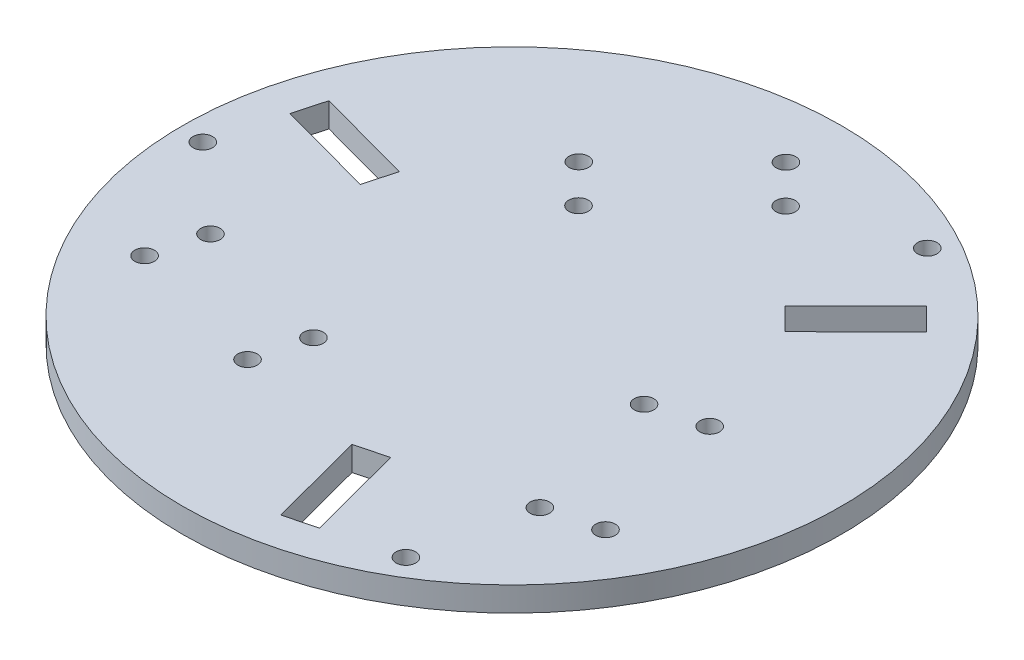
ISO-10303-21;
HEADER;
FILE_DESCRIPTION(('STEP AP214'),'2;1');
FILE_NAME('part.step','',(''),(''),'','','');
FILE_SCHEMA(('AUTOMOTIVE_DESIGN { 1 0 10303 214 1 1 1 1 }'));
ENDSEC;
DATA;
#1=APPLICATION_CONTEXT('core data for automotive mechanical design processes');
#2=APPLICATION_PROTOCOL_DEFINITION('international standard','automotive_design',2000,#1);
#3=PRODUCT_CONTEXT('',#1,'mechanical');
#4=PRODUCT('Part','Part','',(#3));
#5=PRODUCT_RELATED_PRODUCT_CATEGORY('part','',(#4));
#6=PRODUCT_DEFINITION_FORMATION('','',#4);
#7=PRODUCT_DEFINITION_CONTEXT('part definition',#1,'design');
#8=PRODUCT_DEFINITION('design','',#6,#7);
#9=PRODUCT_DEFINITION_SHAPE('','',#8);
#10=(LENGTH_UNIT() NAMED_UNIT(*) SI_UNIT(.MILLI.,.METRE.));
#11=(NAMED_UNIT(*) PLANE_ANGLE_UNIT() SI_UNIT($,.RADIAN.));
#12=(NAMED_UNIT(*) SI_UNIT($,.STERADIAN.) SOLID_ANGLE_UNIT());
#13=UNCERTAINTY_MEASURE_WITH_UNIT(LENGTH_MEASURE(1.E-05),#10,'distance_accuracy_value','');
#14=(GEOMETRIC_REPRESENTATION_CONTEXT(3) GLOBAL_UNCERTAINTY_ASSIGNED_CONTEXT((#13)) GLOBAL_UNIT_ASSIGNED_CONTEXT((#10,
#11,#12)) REPRESENTATION_CONTEXT('',''));
#15=CARTESIAN_POINT('',(0.,0.,0.));
#16=DIRECTION('',(0.,0.,1.));
#17=DIRECTION('',(1.,0.,0.));
#18=AXIS2_PLACEMENT_3D('',#15,#16,#17);
#19=CARTESIAN_POINT('',(0.,5.,0.));
#20=DIRECTION('',(0.,-1.,0.));
#21=DIRECTION('',(0.,0.,-1.));
#22=AXIS2_PLACEMENT_3D('',#19,#20,#21);
#23=CYLINDRICAL_SURFACE('',#22,67.5);
#24=CARTESIAN_POINT('',(0.,5.,0.));
#25=DIRECTION('',(0.,1.,0.));
#26=DIRECTION('',(0.,0.,1.));
#27=AXIS2_PLACEMENT_3D('',#24,#25,#26);
#28=CIRCLE('',#27,67.5);
#29=CARTESIAN_POINT('',(0.,5.,67.5));
#30=VERTEX_POINT('',#29);
#31=EDGE_CURVE('E11',#30,#30,#28,.T.);
#32=ORIENTED_EDGE('',*,*,#31,.F.);
#33=EDGE_LOOP('',(#32));
#34=FACE_BOUND('',#33,.T.);
#35=CARTESIAN_POINT('',(0.,0.,0.));
#36=DIRECTION('',(0.,1.,0.));
#37=DIRECTION('',(0.,0.,1.));
#38=AXIS2_PLACEMENT_3D('',#35,#36,#37);
#39=CIRCLE('',#38,67.5);
#40=CARTESIAN_POINT('',(0.,0.,67.5));
#41=VERTEX_POINT('',#40);
#42=EDGE_CURVE('E48',#41,#41,#39,.T.);
#43=ORIENTED_EDGE('',*,*,#42,.T.);
#44=EDGE_LOOP('',(#43));
#45=FACE_BOUND('',#44,.T.);
#46=ADVANCED_FACE('F45',(#34,#45),#23,.T.);
#47=CARTESIAN_POINT('',(0.,5.,0.));
#48=DIRECTION('',(0.,1.,0.));
#49=DIRECTION('',(0.,0.,1.));
#50=AXIS2_PLACEMENT_3D('',#47,#48,#49);
#51=PLANE('',#50);
#52=CARTESIAN_POINT('',(-62.4944099963683,5.,0.83589425516685));
#53=DIRECTION('',(0.,1.,0.));
#54=DIRECTION('',(0.866025403784436,0.,-0.500000000000004));
#55=AXIS2_PLACEMENT_3D('',#52,#53,#54);
#56=CIRCLE('',#55,2.00000000000001);
#57=CARTESIAN_POINT('',(-60.7623591887994,5.,-0.164105744833164));
#58=VERTEX_POINT('',#57);
#59=EDGE_CURVE('E203',#58,#58,#56,.T.);
#60=ORIENTED_EDGE('',*,*,#59,.F.);
#61=EDGE_LOOP('',(#60));
#62=FACE_BOUND('',#61,.T.);
#63=CARTESIAN_POINT('',(47.4957757996104,5.,28.345459373978));
#64=DIRECTION('',(0.,1.,0.));
#65=DIRECTION('',(-0.866025403784443,0.,-0.499999999999992));
#66=AXIS2_PLACEMENT_3D('',#63,#64,#65);
#67=CIRCLE('',#66,2.00000000000001);
#68=CARTESIAN_POINT('',(45.7637249920415,5.,27.345459373978));
#69=VERTEX_POINT('',#68);
#70=EDGE_CURVE('E194',#69,#69,#67,.T.);
#71=ORIENTED_EDGE('',*,*,#70,.F.);
#72=EDGE_LOOP('',(#71));
#73=FACE_BOUND('',#72,.T.);
#74=CARTESIAN_POINT('',(36.8607185249614,5.,31.1553627112718));
#75=DIRECTION('',(0.,1.,0.));
#76=DIRECTION('',(-0.866025403784443,0.,-0.499999999999992));
#77=AXIS2_PLACEMENT_3D('',#74,#75,#76);
#78=CIRCLE('',#77,2.);
#79=CARTESIAN_POINT('',(35.1286677173925,5.,30.1553627112718));
#80=VERTEX_POINT('',#79);
#81=EDGE_CURVE('E185',#80,#80,#78,.T.);
#82=ORIENTED_EDGE('',*,*,#81,.F.);
#83=EDGE_LOOP('',(#82));
#84=FACE_BOUND('',#83,.T.);
#85=CARTESIAN_POINT('',(39.8324030615365,5.,-0.659242284155745));
#86=DIRECTION('',(0.,1.,0.));
#87=DIRECTION('',(-0.866025403784443,0.,-0.499999999999992));
#88=AXIS2_PLACEMENT_3D('',#85,#86,#87);
#89=CIRCLE('',#88,2.00000000000001);
#90=CARTESIAN_POINT('',(38.1003522539676,5.,-1.65924228415573));
#91=VERTEX_POINT('',#90);
#92=EDGE_CURVE('E195',#91,#91,#89,.T.);
#93=ORIENTED_EDGE('',*,*,#92,.F.);
#94=EDGE_LOOP('',(#93));
#95=FACE_BOUND('',#94,.T.);
#96=CARTESIAN_POINT('',(-45.4116948345605,5.,16.3446372887281));
#97=DIRECTION('',(0.,1.,0.));
#98=DIRECTION('',(0.866025403784436,0.,-0.500000000000004));
#99=AXIS2_PLACEMENT_3D('',#96,#97,#98);
#100=CIRCLE('',#99,2.);
#101=CARTESIAN_POINT('',(-43.6796440269916,5.,15.3446372887281));
#102=VERTEX_POINT('',#101);
#103=EDGE_CURVE('E268',#102,#102,#100,.T.);
#104=ORIENTED_EDGE('',*,*,#103,.F.);
#105=EDGE_LOOP('',(#104));
#106=FACE_BOUND('',#105,.T.);
#107=CARTESIAN_POINT('',(-19.3452809654406,5.,34.8254940871494));
#108=DIRECTION('',(0.,1.,0.));
#109=DIRECTION('',(0.866025403784436,0.,-0.500000000000004));
#110=AXIS2_PLACEMENT_3D('',#107,#108,#109);
#111=CIRCLE('',#110,2.00000000000001);
#112=CARTESIAN_POINT('',(-17.6132301578718,5.,33.8254940871494));
#113=VERTEX_POINT('',#112);
#114=EDGE_CURVE('E228',#113,#113,#111,.T.);
#115=ORIENTED_EDGE('',*,*,#114,.F.);
#116=EDGE_LOOP('',(#115));
#117=FACE_BOUND('',#116,.T.);
#118=CARTESIAN_POINT('',(-16.4612000003912,5.,24.210312647954));
#119=DIRECTION('',(0.,1.,0.));
#120=DIRECTION('',(0.866025403784436,0.,-0.500000000000004));
#121=AXIS2_PLACEMENT_3D('',#118,#119,#120);
#122=CIRCLE('',#121,1.99999999999999);
#123=CARTESIAN_POINT('',(-14.7291491928223,5.,23.210312647954));
#124=VERTEX_POINT('',#123);
#125=EDGE_CURVE('E219',#124,#124,#122,.T.);
#126=ORIENTED_EDGE('',*,*,#125,.F.);
#127=EDGE_LOOP('',(#126));
#128=FACE_BOUND('',#127,.T.);
#129=DIRECTION('',(0.262189178640864,0.,-0.965016494472312));
#130=VECTOR('',#129,1.);
#131=CARTESIAN_POINT('',(-38.8419520885836,5.,-7.77669605519475));
#132=LINE('',#131,#130);
#133=CARTESIAN_POINT('',(-38.8419520885836,5.,-7.77669605519475));
#134=VERTEX_POINT('',#133);
#135=CARTESIAN_POINT('',(-37.137722427418,5.,-14.0493032692648));
#136=VERTEX_POINT('',#135);
#137=EDGE_CURVE('E60',#134,#136,#132,.T.);
#138=ORIENTED_EDGE('',*,*,#137,.F.);
#139=DIRECTION('',(0.965016494472312,0.,0.262189178640862));
#140=VECTOR('',#139,1.);
#141=CARTESIAN_POINT('',(-38.8419520885836,5.,-7.77669605519475));
#142=LINE('',#141,#140);
#143=CARTESIAN_POINT('',(-58.624790225266,5.,-13.1515742173324));
#144=VERTEX_POINT('',#143);
#145=EDGE_CURVE('E249',#144,#134,#142,.T.);
#146=ORIENTED_EDGE('',*,*,#145,.F.);
#147=DIRECTION('',(-0.262189178640862,0.,0.965016494472312));
#148=VECTOR('',#147,1.);
#149=CARTESIAN_POINT('',(-58.624790225266,5.,-13.1515742173324));
#150=LINE('',#149,#148);
#151=CARTESIAN_POINT('',(-56.9205605641004,5.,-19.4241814314025));
#152=VERTEX_POINT('',#151);
#153=EDGE_CURVE('E245',#152,#144,#150,.T.);
#154=ORIENTED_EDGE('',*,*,#153,.F.);
#155=DIRECTION('',(-0.965016494472312,0.,-0.262189178640862));
#156=VECTOR('',#155,1.);
#157=CARTESIAN_POINT('',(-37.137722427418,5.,-14.0493032692648));
#158=LINE('',#157,#156);
#159=EDGE_CURVE('E241',#136,#152,#158,.T.);
#160=ORIENTED_EDGE('',*,*,#159,.F.);
#161=EDGE_LOOP('',(#138,#146,#154,#160));
#162=FACE_BOUND('',#161,.T.);
#163=CARTESIAN_POINT('',(31.9711106580364,5.,53.7037995237915));
#164=DIRECTION('',(0.,1.,0.));
#165=DIRECTION('',(-0.866025403784443,0.,-0.499999999999992));
#166=AXIS2_PLACEMENT_3D('',#163,#164,#165);
#167=CIRCLE('',#166,2.00000000000001);
#168=CARTESIAN_POINT('',(30.2390598504675,5.,52.7037995237916));
#169=VERTEX_POINT('',#168);
#170=EDGE_CURVE('E695',#169,#169,#167,.T.);
#171=ORIENTED_EDGE('',*,*,#170,.F.);
#172=EDGE_LOOP('',(#171));
#173=FACE_BOUND('',#172,.T.);
#174=DIRECTION('',(-0.966823388604458,0.,0.255445757935796));
#175=VECTOR('',#174,1.);
#176=CARTESIAN_POINT('',(12.6861597029831,5.,37.5264652688887));
#177=LINE('',#176,#175);
#178=CARTESIAN_POINT('',(12.6861597029831,5.,37.5264652688887));
#179=VERTEX_POINT('',#178);
#180=CARTESIAN_POINT('',(6.40180767705409,5.,39.1868626954714));
#181=VERTEX_POINT('',#180);
#182=EDGE_CURVE('E68',#179,#181,#177,.T.);
#183=ORIENTED_EDGE('',*,*,#182,.F.);
#184=DIRECTION('',(-0.255445757935797,0.,-0.966823388604457));
#185=VECTOR('',#184,1.);
#186=CARTESIAN_POINT('',(12.6861597029831,5.,37.5264652688887));
#187=LINE('',#186,#185);
#188=CARTESIAN_POINT('',(17.9227977406669,5.,57.3463447352801));
#189=VERTEX_POINT('',#188);
#190=EDGE_CURVE('E143',#189,#179,#187,.T.);
#191=ORIENTED_EDGE('',*,*,#190,.F.);
#192=DIRECTION('',(0.966823388604457,0.,-0.255445757935798));
#193=VECTOR('',#192,1.);
#194=CARTESIAN_POINT('',(17.9227977406669,5.,57.3463447352801));
#195=LINE('',#194,#193);
#196=CARTESIAN_POINT('',(11.6384457147379,5.,59.0067421618628));
#197=VERTEX_POINT('',#196);
#198=EDGE_CURVE('E171',#197,#189,#195,.T.);
#199=ORIENTED_EDGE('',*,*,#198,.F.);
#200=DIRECTION('',(0.255445757935798,0.,0.966823388604457));
#201=VECTOR('',#200,1.);
#202=CARTESIAN_POINT('',(6.40180767705409,5.,39.1868626954714));
#203=LINE('',#202,#201);
#204=EDGE_CURVE('E163',#181,#197,#203,.T.);
#205=ORIENTED_EDGE('',*,*,#204,.F.);
#206=EDGE_LOOP('',(#183,#191,#199,#205));
#207=FACE_BOUND('',#206,.T.);
#208=CARTESIAN_POINT('',(29.1973457868874,5.,2.15066105313803));
#209=DIRECTION('',(0.,1.,0.));
#210=DIRECTION('',(-0.866025403784443,0.,-0.499999999999992));
#211=AXIS2_PLACEMENT_3D('',#208,#209,#210);
#212=CIRCLE('',#211,1.99999999999999);
#213=CARTESIAN_POINT('',(27.4652949793186,5.,1.15066105313806));
#214=VERTEX_POINT('',#213);
#215=EDGE_CURVE('E152',#214,#214,#212,.T.);
#216=ORIENTED_EDGE('',*,*,#215,.F.);
#217=EDGE_LOOP('',(#216));
#218=FACE_BOUND('',#217,.T.);
#219=CARTESIAN_POINT('',(-48.29577579961,5.,26.9598187279236));
#220=DIRECTION('',(0.,1.,0.));
#221=DIRECTION('',(0.866025403784436,0.,-0.500000000000004));
#222=AXIS2_PLACEMENT_3D('',#219,#220,#221);
#223=CIRCLE('',#222,2.00000000000001);
#224=CARTESIAN_POINT('',(-46.5637249920411,5.,25.9598187279235));
#225=VERTEX_POINT('',#224);
#226=EDGE_CURVE('E277',#225,#225,#223,.T.);
#227=ORIENTED_EDGE('',*,*,#226,.F.);
#228=EDGE_LOOP('',(#227));
#229=FACE_BOUND('',#228,.T.);
#230=CARTESIAN_POINT('',(30.5232993383324,5.,-54.5396937789584));
#231=DIRECTION('',(0.,1.,0.));
#232=DIRECTION('',(0.,0.,1.));
#233=AXIS2_PLACEMENT_3D('',#230,#231,#232);
#234=CIRCLE('',#233,2.00000000000001);
#235=CARTESIAN_POINT('',(30.5232993383324,5.,-52.5396937789584));
#236=VERTEX_POINT('',#235);
#237=EDGE_CURVE('E307',#236,#236,#234,.T.);
#238=ORIENTED_EDGE('',*,*,#237,.F.);
#239=EDGE_LOOP('',(#238));
#240=FACE_BOUND('',#239,.T.);
#241=CARTESIAN_POINT('',(8.55097630959952,5.,-47.5));
#242=DIRECTION('',(0.,1.,0.));
#243=DIRECTION('',(0.,0.,1.));
#244=AXIS2_PLACEMENT_3D('',#241,#242,#243);
#245=CIRCLE('',#244,2.);
#246=CARTESIAN_POINT('',(8.55097630959952,5.,-45.5));
#247=VERTEX_POINT('',#246);
#248=EDGE_CURVE('E349',#247,#247,#245,.T.);
#249=ORIENTED_EDGE('',*,*,#248,.F.);
#250=EDGE_LOOP('',(#249));
#251=FACE_BOUND('',#250,.T.);
#252=CARTESIAN_POINT('',(-20.4871220960957,5.,-34.166251802994));
#253=DIRECTION('',(0.,1.,0.));
#254=DIRECTION('',(0.,0.,1.));
#255=AXIS2_PLACEMENT_3D('',#252,#253,#254);
#256=CIRCLE('',#255,2.00000000000001);
#257=CARTESIAN_POINT('',(-20.4871220960957,5.,-32.1662518029939));
#258=VERTEX_POINT('',#257);
#259=EDGE_CURVE('E350',#258,#258,#256,.T.);
#260=ORIENTED_EDGE('',*,*,#259,.F.);
#261=EDGE_LOOP('',(#260));
#262=FACE_BOUND('',#261,.T.);
#263=CARTESIAN_POINT('',(-12.7361457864961,5.,-26.3609737010922));
#264=DIRECTION('',(0.,1.,0.));
#265=DIRECTION('',(0.,0.,1.));
#266=AXIS2_PLACEMENT_3D('',#263,#264,#265);
#267=CIRCLE('',#266,1.99999999999999);
#268=CARTESIAN_POINT('',(-12.7361457864961,5.,-24.3609737010922));
#269=VERTEX_POINT('',#268);
#270=EDGE_CURVE('E296',#269,#269,#267,.T.);
#271=ORIENTED_EDGE('',*,*,#270,.F.);
#272=EDGE_LOOP('',(#271));
#273=FACE_BOUND('',#272,.T.);
#274=DIRECTION('',(0.704634209963592,0.,0.709570736536523));
#275=VECTOR('',#274,1.);
#276=CARTESIAN_POINT('',(26.1557923856008,5.,-29.7497692136939));
#277=LINE('',#276,#275);
#278=CARTESIAN_POINT('',(26.1557923856008,5.,-29.7497692136939));
#279=VERTEX_POINT('',#278);
#280=CARTESIAN_POINT('',(30.7359147503642,5.,-25.1375594262065));
#281=VERTEX_POINT('',#280);
#282=EDGE_CURVE('E332',#279,#281,#277,.T.);
#283=ORIENTED_EDGE('',*,*,#282,.F.);
#284=DIRECTION('',(-0.709570736536522,0.,0.704634209963593));
#285=VECTOR('',#284,1.);
#286=CARTESIAN_POINT('',(26.1557923856008,5.,-29.7497692136939));
#287=LINE('',#286,#285);
#288=CARTESIAN_POINT('',(40.7019924845995,5.,-44.1947705179476));
#289=VERTEX_POINT('',#288);
#290=EDGE_CURVE('E312',#289,#279,#287,.T.);
#291=ORIENTED_EDGE('',*,*,#290,.F.);
#292=DIRECTION('',(-0.704634209963593,0.,-0.709570736536522));
#293=VECTOR('',#292,1.);
#294=CARTESIAN_POINT('',(40.7019924845995,5.,-44.1947705179476));
#295=LINE('',#294,#293);
#296=CARTESIAN_POINT('',(45.2821148493629,5.,-39.5825607304602));
#297=VERTEX_POINT('',#296);
#298=EDGE_CURVE('E324',#297,#289,#295,.T.);
#299=ORIENTED_EDGE('',*,*,#298,.F.);
#300=DIRECTION('',(0.709570736536522,0.,-0.704634209963593));
#301=VECTOR('',#300,1.);
#302=CARTESIAN_POINT('',(30.7359147503642,5.,-25.1375594262065));
#303=LINE('',#302,#301);
#304=EDGE_CURVE('E328',#281,#297,#303,.T.);
#305=ORIENTED_EDGE('',*,*,#304,.F.);
#306=EDGE_LOOP('',(#283,#291,#299,#305));
#307=FACE_BOUND('',#306,.T.);
#308=CARTESIAN_POINT('',(0.79999999999999,5.,-55.3052781019017));
#309=DIRECTION('',(0.,1.,0.));
#310=DIRECTION('',(0.,0.,1.));
#311=AXIS2_PLACEMENT_3D('',#308,#309,#310);
#312=CIRCLE('',#311,2.00000000000001);
#313=CARTESIAN_POINT('',(0.79999999999999,5.,-53.3052781019017));
#314=VERTEX_POINT('',#313);
#315=EDGE_CURVE('E354',#314,#314,#312,.T.);
#316=ORIENTED_EDGE('',*,*,#315,.F.);
#317=EDGE_LOOP('',(#316));
#318=FACE_BOUND('',#317,.T.);
#319=ORIENTED_EDGE('',*,*,#31,.T.);
#320=EDGE_LOOP('',(#319));
#321=FACE_BOUND('',#320,.T.);
#322=ADVANCED_FACE('F382',(#62,#73,#84,#95,#106,#117,#128,#162,#173,#207,#218,#229,#240,#251,
#262,#273,#307,#318,#321),#51,.T.);
#323=CARTESIAN_POINT('',(0.,0.,0.));
#324=DIRECTION('',(0.,1.,0.));
#325=DIRECTION('',(0.,0.,1.));
#326=AXIS2_PLACEMENT_3D('',#323,#324,#325);
#327=PLANE('',#326);
#328=CARTESIAN_POINT('',(-62.4944099963683,0.,0.83589425516685));
#329=DIRECTION('',(0.,1.,0.));
#330=DIRECTION('',(0.,0.,1.));
#331=AXIS2_PLACEMENT_3D('',#328,#329,#330);
#332=CIRCLE('',#331,2.00000000000001);
#333=CARTESIAN_POINT('',(-62.4944099963683,0.,2.83589425516686));
#334=VERTEX_POINT('',#333);
#335=EDGE_CURVE('E207',#334,#334,#332,.F.);
#336=ORIENTED_EDGE('',*,*,#335,.F.);
#337=EDGE_LOOP('',(#336));
#338=FACE_BOUND('',#337,.T.);
#339=CARTESIAN_POINT('',(47.4957757996104,0.,28.345459373978));
#340=DIRECTION('',(0.,1.,0.));
#341=DIRECTION('',(0.,0.,1.));
#342=AXIS2_PLACEMENT_3D('',#339,#340,#341);
#343=CIRCLE('',#342,2.00000000000001);
#344=CARTESIAN_POINT('',(47.4957757996104,0.,30.345459373978));
#345=VERTEX_POINT('',#344);
#346=EDGE_CURVE('E208',#345,#345,#343,.F.);
#347=ORIENTED_EDGE('',*,*,#346,.F.);
#348=EDGE_LOOP('',(#347));
#349=FACE_BOUND('',#348,.T.);
#350=CARTESIAN_POINT('',(36.8607185249614,0.,31.1553627112718));
#351=DIRECTION('',(0.,1.,0.));
#352=DIRECTION('',(0.,0.,1.));
#353=AXIS2_PLACEMENT_3D('',#350,#351,#352);
#354=CIRCLE('',#353,2.);
#355=CARTESIAN_POINT('',(36.8607185249614,0.,33.1553627112718));
#356=VERTEX_POINT('',#355);
#357=EDGE_CURVE('E189',#356,#356,#354,.F.);
#358=ORIENTED_EDGE('',*,*,#357,.F.);
#359=EDGE_LOOP('',(#358));
#360=FACE_BOUND('',#359,.T.);
#361=CARTESIAN_POINT('',(39.8324030615365,0.,-0.659242284155745));
#362=DIRECTION('',(0.,1.,0.));
#363=DIRECTION('',(0.,0.,1.));
#364=AXIS2_PLACEMENT_3D('',#361,#362,#363);
#365=CIRCLE('',#364,2.00000000000001);
#366=CARTESIAN_POINT('',(39.8324030615365,0.,1.34075771584426));
#367=VERTEX_POINT('',#366);
#368=EDGE_CURVE('E190',#367,#367,#365,.F.);
#369=ORIENTED_EDGE('',*,*,#368,.F.);
#370=EDGE_LOOP('',(#369));
#371=FACE_BOUND('',#370,.T.);
#372=CARTESIAN_POINT('',(-45.4116948345605,0.,16.3446372887281));
#373=DIRECTION('',(0.,1.,0.));
#374=DIRECTION('',(0.,0.,1.));
#375=AXIS2_PLACEMENT_3D('',#372,#373,#374);
#376=CIRCLE('',#375,2.);
#377=CARTESIAN_POINT('',(-45.4116948345605,0.,18.3446372887281));
#378=VERTEX_POINT('',#377);
#379=EDGE_CURVE('E272',#378,#378,#376,.F.);
#380=ORIENTED_EDGE('',*,*,#379,.F.);
#381=EDGE_LOOP('',(#380));
#382=FACE_BOUND('',#381,.T.);
#383=CARTESIAN_POINT('',(-19.3452809654406,0.,34.8254940871494));
#384=DIRECTION('',(0.,1.,0.));
#385=DIRECTION('',(0.,0.,1.));
#386=AXIS2_PLACEMENT_3D('',#383,#384,#385);
#387=CIRCLE('',#386,2.00000000000001);
#388=CARTESIAN_POINT('',(-19.3452809654406,0.,36.8254940871494));
#389=VERTEX_POINT('',#388);
#390=EDGE_CURVE('E273',#389,#389,#387,.F.);
#391=ORIENTED_EDGE('',*,*,#390,.F.);
#392=EDGE_LOOP('',(#391));
#393=FACE_BOUND('',#392,.T.);
#394=CARTESIAN_POINT('',(-16.4612000003912,0.,24.210312647954));
#395=DIRECTION('',(0.,1.,0.));
#396=DIRECTION('',(0.,0.,1.));
#397=AXIS2_PLACEMENT_3D('',#394,#395,#396);
#398=CIRCLE('',#397,1.99999999999999);
#399=CARTESIAN_POINT('',(-16.4612000003912,0.,26.210312647954));
#400=VERTEX_POINT('',#399);
#401=EDGE_CURVE('E223',#400,#400,#398,.F.);
#402=ORIENTED_EDGE('',*,*,#401,.F.);
#403=EDGE_LOOP('',(#402));
#404=FACE_BOUND('',#403,.T.);
#405=DIRECTION('',(-0.965016494472312,0.,-0.262189178640862));
#406=VECTOR('',#405,1.);
#407=CARTESIAN_POINT('',(-38.8419520885836,0.,-7.77669605519475));
#408=LINE('',#407,#406);
#409=CARTESIAN_POINT('',(-38.8419520885836,0.,-7.77669605519475));
#410=VERTEX_POINT('',#409);
#411=CARTESIAN_POINT('',(-58.624790225266,0.,-13.1515742173324));
#412=VERTEX_POINT('',#411);
#413=EDGE_CURVE('E231',#410,#412,#408,.T.);
#414=ORIENTED_EDGE('',*,*,#413,.F.);
#415=DIRECTION('',(-0.262189178640863,0.,0.965016494472312));
#416=VECTOR('',#415,1.);
#417=CARTESIAN_POINT('',(-38.8419520885836,0.,-7.77669605519475));
#418=LINE('',#417,#416);
#419=CARTESIAN_POINT('',(-37.137722427418,0.,-14.0493032692648));
#420=VERTEX_POINT('',#419);
#421=EDGE_CURVE('E235',#420,#410,#418,.T.);
#422=ORIENTED_EDGE('',*,*,#421,.F.);
#423=DIRECTION('',(0.965016494472312,0.,0.262189178640862));
#424=VECTOR('',#423,1.);
#425=CARTESIAN_POINT('',(-37.137722427418,0.,-14.0493032692648));
#426=LINE('',#425,#424);
#427=CARTESIAN_POINT('',(-56.9205605641004,0.,-19.4241814314025));
#428=VERTEX_POINT('',#427);
#429=EDGE_CURVE('E224',#428,#420,#426,.T.);
#430=ORIENTED_EDGE('',*,*,#429,.F.);
#431=DIRECTION('',(0.262189178640862,0.,-0.965016494472312));
#432=VECTOR('',#431,1.);
#433=CARTESIAN_POINT('',(-58.624790225266,0.,-13.1515742173324));
#434=LINE('',#433,#432);
#435=EDGE_CURVE('E212',#412,#428,#434,.T.);
#436=ORIENTED_EDGE('',*,*,#435,.F.);
#437=EDGE_LOOP('',(#414,#422,#430,#436));
#438=FACE_BOUND('',#437,.T.);
#439=CARTESIAN_POINT('',(31.9711106580364,0.,53.7037995237915));
#440=DIRECTION('',(0.,1.,0.));
#441=DIRECTION('',(0.,0.,1.));
#442=AXIS2_PLACEMENT_3D('',#439,#440,#441);
#443=CIRCLE('',#442,2.00000000000001);
#444=CARTESIAN_POINT('',(31.9711106580364,0.,55.7037995237916));
#445=VERTEX_POINT('',#444);
#446=EDGE_CURVE('E745',#445,#445,#443,.F.);
#447=ORIENTED_EDGE('',*,*,#446,.F.);
#448=EDGE_LOOP('',(#447));
#449=FACE_BOUND('',#448,.T.);
#450=DIRECTION('',(0.255445757935797,0.,0.966823388604458));
#451=VECTOR('',#450,1.);
#452=CARTESIAN_POINT('',(12.6861597029831,0.,37.5264652688887));
#453=LINE('',#452,#451);
#454=CARTESIAN_POINT('',(12.6861597029831,0.,37.5264652688887));
#455=VERTEX_POINT('',#454);
#456=CARTESIAN_POINT('',(17.9227977406669,0.,57.3463447352801));
#457=VERTEX_POINT('',#456);
#458=EDGE_CURVE('E158',#455,#457,#453,.T.);
#459=ORIENTED_EDGE('',*,*,#458,.F.);
#460=DIRECTION('',(0.966823388604458,0.,-0.255445757935796));
#461=VECTOR('',#460,1.);
#462=CARTESIAN_POINT('',(12.6861597029831,0.,37.5264652688887));
#463=LINE('',#462,#461);
#464=CARTESIAN_POINT('',(6.40180767705409,0.,39.1868626954714));
#465=VERTEX_POINT('',#464);
#466=EDGE_CURVE('E136',#465,#455,#463,.T.);
#467=ORIENTED_EDGE('',*,*,#466,.F.);
#468=DIRECTION('',(-0.255445757935798,0.,-0.966823388604458));
#469=VECTOR('',#468,1.);
#470=CARTESIAN_POINT('',(6.40180767705409,0.,39.1868626954714));
#471=LINE('',#470,#469);
#472=CARTESIAN_POINT('',(11.6384457147379,0.,59.0067421618628));
#473=VERTEX_POINT('',#472);
#474=EDGE_CURVE('E147',#473,#465,#471,.T.);
#475=ORIENTED_EDGE('',*,*,#474,.F.);
#476=DIRECTION('',(-0.966823388604458,0.,0.255445757935798));
#477=VECTOR('',#476,1.);
#478=CARTESIAN_POINT('',(17.9227977406669,0.,57.3463447352801));
#479=LINE('',#478,#477);
#480=EDGE_CURVE('E165',#457,#473,#479,.T.);
#481=ORIENTED_EDGE('',*,*,#480,.F.);
#482=EDGE_LOOP('',(#459,#467,#475,#481));
#483=FACE_BOUND('',#482,.T.);
#484=CARTESIAN_POINT('',(29.1973457868874,0.,2.15066105313803));
#485=DIRECTION('',(0.,1.,0.));
#486=DIRECTION('',(0.,0.,1.));
#487=AXIS2_PLACEMENT_3D('',#484,#485,#486);
#488=CIRCLE('',#487,1.99999999999999);
#489=CARTESIAN_POINT('',(29.1973457868874,0.,4.15066105313802));
#490=VERTEX_POINT('',#489);
#491=EDGE_CURVE('E199',#490,#490,#488,.F.);
#492=ORIENTED_EDGE('',*,*,#491,.F.);
#493=EDGE_LOOP('',(#492));
#494=FACE_BOUND('',#493,.T.);
#495=CARTESIAN_POINT('',(-48.29577579961,0.,26.9598187279236));
#496=DIRECTION('',(0.,1.,0.));
#497=DIRECTION('',(0.,0.,1.));
#498=AXIS2_PLACEMENT_3D('',#495,#496,#497);
#499=CIRCLE('',#498,2.00000000000001);
#500=CARTESIAN_POINT('',(-48.29577579961,0.,28.9598187279236));
#501=VERTEX_POINT('',#500);
#502=EDGE_CURVE('E287',#501,#501,#499,.F.);
#503=ORIENTED_EDGE('',*,*,#502,.F.);
#504=EDGE_LOOP('',(#503));
#505=FACE_BOUND('',#504,.T.);
#506=CARTESIAN_POINT('',(30.5232993383324,0.,-54.5396937789584));
#507=DIRECTION('',(0.,1.,0.));
#508=DIRECTION('',(0.,0.,1.));
#509=AXIS2_PLACEMENT_3D('',#506,#507,#508);
#510=CIRCLE('',#509,2.00000000000001);
#511=CARTESIAN_POINT('',(30.5232993383324,0.,-52.5396937789584));
#512=VERTEX_POINT('',#511);
#513=EDGE_CURVE('E291',#512,#512,#510,.F.);
#514=ORIENTED_EDGE('',*,*,#513,.F.);
#515=EDGE_LOOP('',(#514));
#516=FACE_BOUND('',#515,.T.);
#517=CARTESIAN_POINT('',(8.55097630959952,0.,-47.5));
#518=DIRECTION('',(0.,1.,0.));
#519=DIRECTION('',(0.,0.,1.));
#520=AXIS2_PLACEMENT_3D('',#517,#518,#519);
#521=CIRCLE('',#520,2.);
#522=CARTESIAN_POINT('',(8.55097630959952,0.,-45.5));
#523=VERTEX_POINT('',#522);
#524=EDGE_CURVE('E345',#523,#523,#521,.F.);
#525=ORIENTED_EDGE('',*,*,#524,.F.);
#526=EDGE_LOOP('',(#525));
#527=FACE_BOUND('',#526,.T.);
#528=CARTESIAN_POINT('',(-20.4871220960957,0.,-34.166251802994));
#529=DIRECTION('',(0.,1.,0.));
#530=DIRECTION('',(0.,0.,1.));
#531=AXIS2_PLACEMENT_3D('',#528,#529,#530);
#532=CIRCLE('',#531,2.00000000000001);
#533=CARTESIAN_POINT('',(-20.4871220960957,0.,-32.1662518029939));
#534=VERTEX_POINT('',#533);
#535=EDGE_CURVE('E301',#534,#534,#532,.F.);
#536=ORIENTED_EDGE('',*,*,#535,.F.);
#537=EDGE_LOOP('',(#536));
#538=FACE_BOUND('',#537,.T.);
#539=CARTESIAN_POINT('',(-12.7361457864961,0.,-26.3609737010922));
#540=DIRECTION('',(0.,1.,0.));
#541=DIRECTION('',(0.,0.,1.));
#542=AXIS2_PLACEMENT_3D('',#539,#540,#541);
#543=CIRCLE('',#542,1.99999999999999);
#544=CARTESIAN_POINT('',(-12.7361457864961,0.,-24.3609737010922));
#545=VERTEX_POINT('',#544);
#546=EDGE_CURVE('E292',#545,#545,#543,.F.);
#547=ORIENTED_EDGE('',*,*,#546,.F.);
#548=EDGE_LOOP('',(#547));
#549=FACE_BOUND('',#548,.T.);
#550=DIRECTION('',(0.709570736536522,0.,-0.704634209963593));
#551=VECTOR('',#550,1.);
#552=CARTESIAN_POINT('',(26.1557923856008,0.,-29.7497692136939));
#553=LINE('',#552,#551);
#554=CARTESIAN_POINT('',(26.1557923856008,0.,-29.7497692136939));
#555=VERTEX_POINT('',#554);
#556=CARTESIAN_POINT('',(40.7019924845995,0.,-44.1947705179476));
#557=VERTEX_POINT('',#556);
#558=EDGE_CURVE('E339',#555,#557,#553,.T.);
#559=ORIENTED_EDGE('',*,*,#558,.F.);
#560=DIRECTION('',(-0.704634209963592,0.,-0.709570736536523));
#561=VECTOR('',#560,1.);
#562=CARTESIAN_POINT('',(26.1557923856008,0.,-29.7497692136939));
#563=LINE('',#562,#561);
#564=CARTESIAN_POINT('',(30.7359147503642,0.,-25.1375594262065));
#565=VERTEX_POINT('',#564);
#566=EDGE_CURVE('E335',#565,#555,#563,.T.);
#567=ORIENTED_EDGE('',*,*,#566,.F.);
#568=DIRECTION('',(-0.709570736536522,0.,0.704634209963593));
#569=VECTOR('',#568,1.);
#570=CARTESIAN_POINT('',(30.7359147503642,0.,-25.1375594262065));
#571=LINE('',#570,#569);
#572=CARTESIAN_POINT('',(45.2821148493629,0.,-39.5825607304602));
#573=VERTEX_POINT('',#572);
#574=EDGE_CURVE('E302',#573,#565,#571,.T.);
#575=ORIENTED_EDGE('',*,*,#574,.F.);
#576=DIRECTION('',(0.704634209963593,0.,0.709570736536522));
#577=VECTOR('',#576,1.);
#578=CARTESIAN_POINT('',(40.7019924845995,0.,-44.1947705179476));
#579=LINE('',#578,#577);
#580=EDGE_CURVE('E297',#557,#573,#579,.T.);
#581=ORIENTED_EDGE('',*,*,#580,.F.);
#582=EDGE_LOOP('',(#559,#567,#575,#581));
#583=FACE_BOUND('',#582,.T.);
#584=CARTESIAN_POINT('',(0.79999999999999,0.,-55.3052781019017));
#585=DIRECTION('',(0.,1.,0.));
#586=DIRECTION('',(0.,0.,1.));
#587=AXIS2_PLACEMENT_3D('',#584,#585,#586);
#588=CIRCLE('',#587,2.00000000000001);
#589=CARTESIAN_POINT('',(0.79999999999999,0.,-53.3052781019017));
#590=VERTEX_POINT('',#589);
#591=EDGE_CURVE('E370',#590,#590,#588,.F.);
#592=ORIENTED_EDGE('',*,*,#591,.F.);
#593=EDGE_LOOP('',(#592));
#594=FACE_BOUND('',#593,.T.);
#595=ORIENTED_EDGE('',*,*,#42,.F.);
#596=EDGE_LOOP('',(#595));
#597=FACE_BOUND('',#596,.T.);
#598=ADVANCED_FACE('F155',(#338,#349,#360,#371,#382,#393,#404,#438,#449,#483,#494,#505,#516,
#527,#538,#549,#583,#594,#597),#327,.F.);
#599=CARTESIAN_POINT('',(0.79999999999999,-0.00100000000000013,-55.3052781019017));
#600=DIRECTION('',(0.,1.,0.));
#601=DIRECTION('',(0.,0.,1.));
#602=AXIS2_PLACEMENT_3D('',#599,#600,#601);
#603=CYLINDRICAL_SURFACE('',#602,2.00000000000001);
#604=ORIENTED_EDGE('',*,*,#315,.T.);
#605=EDGE_LOOP('',(#604));
#606=FACE_BOUND('',#605,.T.);
#607=ORIENTED_EDGE('',*,*,#591,.T.);
#608=EDGE_LOOP('',(#607));
#609=FACE_BOUND('',#608,.T.);
#610=ADVANCED_FACE('F381',(#606,#609),#603,.F.);
#611=CARTESIAN_POINT('',(26.1557923856008,-0.00100000000000013,-29.7497692136939));
#612=DIRECTION('',(-0.709570736536523,0.,0.704634209963592));
#613=DIRECTION('',(0.704634209963592,0.,0.709570736536523));
#614=AXIS2_PLACEMENT_3D('',#611,#612,#613);
#615=PLANE('',#614);
#616=ORIENTED_EDGE('',*,*,#566,.T.);
#617=DIRECTION('',(0.,1.,0.));
#618=VECTOR('',#617,1.);
#619=CARTESIAN_POINT('',(26.1557923856008,-0.00100000000000013,-29.7497692136939));
#620=LINE('',#619,#618);
#621=EDGE_CURVE('E306',#555,#279,#620,.T.);
#622=ORIENTED_EDGE('',*,*,#621,.T.);
#623=ORIENTED_EDGE('',*,*,#282,.T.);
#624=DIRECTION('',(0.,1.,0.));
#625=VECTOR('',#624,1.);
#626=CARTESIAN_POINT('',(30.7359147503642,-0.00100000000000013,-25.1375594262065));
#627=LINE('',#626,#625);
#628=EDGE_CURVE('E308',#565,#281,#627,.T.);
#629=ORIENTED_EDGE('',*,*,#628,.F.);
#630=EDGE_LOOP('',(#616,#622,#623,#629));
#631=FACE_BOUND('',#630,.T.);
#632=ADVANCED_FACE('F389',(#631),#615,.F.);
#633=CARTESIAN_POINT('',(26.1557923856008,-0.00100000000000013,-29.7497692136939));
#634=DIRECTION('',(-0.704634209963593,0.,-0.709570736536522));
#635=DIRECTION('',(-0.709570736536522,0.,0.704634209963593));
#636=AXIS2_PLACEMENT_3D('',#633,#634,#635);
#637=PLANE('',#636);
#638=ORIENTED_EDGE('',*,*,#558,.T.);
#639=DIRECTION('',(0.,1.,0.));
#640=VECTOR('',#639,1.);
#641=CARTESIAN_POINT('',(40.7019924845995,-0.00100000000000013,-44.1947705179476));
#642=LINE('',#641,#640);
#643=EDGE_CURVE('E316',#557,#289,#642,.T.);
#644=ORIENTED_EDGE('',*,*,#643,.T.);
#645=ORIENTED_EDGE('',*,*,#290,.T.);
#646=ORIENTED_EDGE('',*,*,#621,.F.);
#647=EDGE_LOOP('',(#638,#644,#645,#646));
#648=FACE_BOUND('',#647,.T.);
#649=ADVANCED_FACE('F415',(#648),#637,.F.);
#650=CARTESIAN_POINT('',(40.7019924845995,-0.00100000000000013,-44.1947705179476));
#651=DIRECTION('',(0.709570736536522,0.,-0.704634209963593));
#652=DIRECTION('',(-0.704634209963593,0.,-0.709570736536522));
#653=AXIS2_PLACEMENT_3D('',#650,#651,#652);
#654=PLANE('',#653);
#655=ORIENTED_EDGE('',*,*,#580,.T.);
#656=DIRECTION('',(0.,1.,0.));
#657=VECTOR('',#656,1.);
#658=CARTESIAN_POINT('',(45.2821148493629,-0.00100000000000013,-39.5825607304602));
#659=LINE('',#658,#657);
#660=EDGE_CURVE('E313',#573,#297,#659,.T.);
#661=ORIENTED_EDGE('',*,*,#660,.T.);
#662=ORIENTED_EDGE('',*,*,#298,.T.);
#663=ORIENTED_EDGE('',*,*,#643,.F.);
#664=EDGE_LOOP('',(#655,#661,#662,#663));
#665=FACE_BOUND('',#664,.T.);
#666=ADVANCED_FACE('F424',(#665),#654,.F.);
#667=CARTESIAN_POINT('',(30.7359147503642,-0.00100000000000013,-25.1375594262065));
#668=DIRECTION('',(0.704634209963593,0.,0.709570736536522));
#669=DIRECTION('',(0.709570736536522,0.,-0.704634209963593));
#670=AXIS2_PLACEMENT_3D('',#667,#668,#669);
#671=PLANE('',#670);
#672=ORIENTED_EDGE('',*,*,#574,.T.);
#673=ORIENTED_EDGE('',*,*,#628,.T.);
#674=ORIENTED_EDGE('',*,*,#304,.T.);
#675=ORIENTED_EDGE('',*,*,#660,.F.);
#676=EDGE_LOOP('',(#672,#673,#674,#675));
#677=FACE_BOUND('',#676,.T.);
#678=ADVANCED_FACE('F433',(#677),#671,.F.);
#679=CARTESIAN_POINT('',(-12.7361457864961,-0.00100000000000013,-26.3609737010922));
#680=DIRECTION('',(0.,1.,0.));
#681=DIRECTION('',(0.,0.,1.));
#682=AXIS2_PLACEMENT_3D('',#679,#680,#681);
#683=CYLINDRICAL_SURFACE('',#682,1.99999999999999);
#684=ORIENTED_EDGE('',*,*,#270,.T.);
#685=EDGE_LOOP('',(#684));
#686=FACE_BOUND('',#685,.T.);
#687=ORIENTED_EDGE('',*,*,#546,.T.);
#688=EDGE_LOOP('',(#687));
#689=FACE_BOUND('',#688,.T.);
#690=ADVANCED_FACE('F442',(#686,#689),#683,.F.);
#691=CARTESIAN_POINT('',(-20.4871220960957,-0.00100000000000013,-34.166251802994));
#692=DIRECTION('',(0.,1.,0.));
#693=DIRECTION('',(0.,0.,1.));
#694=AXIS2_PLACEMENT_3D('',#691,#692,#693);
#695=CYLINDRICAL_SURFACE('',#694,2.00000000000001);
#696=ORIENTED_EDGE('',*,*,#259,.T.);
#697=EDGE_LOOP('',(#696));
#698=FACE_BOUND('',#697,.T.);
#699=ORIENTED_EDGE('',*,*,#535,.T.);
#700=EDGE_LOOP('',(#699));
#701=FACE_BOUND('',#700,.T.);
#702=ADVANCED_FACE('F451',(#698,#701),#695,.F.);
#703=CARTESIAN_POINT('',(8.55097630959952,-0.00100000000000013,-47.5));
#704=DIRECTION('',(0.,1.,0.));
#705=DIRECTION('',(0.,0.,1.));
#706=AXIS2_PLACEMENT_3D('',#703,#704,#705);
#707=CYLINDRICAL_SURFACE('',#706,2.);
#708=ORIENTED_EDGE('',*,*,#248,.T.);
#709=EDGE_LOOP('',(#708));
#710=FACE_BOUND('',#709,.T.);
#711=ORIENTED_EDGE('',*,*,#524,.T.);
#712=EDGE_LOOP('',(#711));
#713=FACE_BOUND('',#712,.T.);
#714=ADVANCED_FACE('F460',(#710,#713),#707,.F.);
#715=CARTESIAN_POINT('',(30.5232993383324,-0.00100000000000013,-54.5396937789584));
#716=DIRECTION('',(0.,1.,0.));
#717=DIRECTION('',(0.,0.,1.));
#718=AXIS2_PLACEMENT_3D('',#715,#716,#717);
#719=CYLINDRICAL_SURFACE('',#718,2.00000000000001);
#720=ORIENTED_EDGE('',*,*,#237,.T.);
#721=EDGE_LOOP('',(#720));
#722=FACE_BOUND('',#721,.T.);
#723=ORIENTED_EDGE('',*,*,#513,.T.);
#724=EDGE_LOOP('',(#723));
#725=FACE_BOUND('',#724,.T.);
#726=ADVANCED_FACE('F469',(#722,#725),#719,.F.);
#727=CARTESIAN_POINT('',(-48.29577579961,-0.00100000000000013,26.9598187279236));
#728=DIRECTION('',(0.,1.,0.));
#729=DIRECTION('',(0.,0.,1.));
#730=AXIS2_PLACEMENT_3D('',#727,#728,#729);
#731=CYLINDRICAL_SURFACE('',#730,2.00000000000001);
#732=ORIENTED_EDGE('',*,*,#226,.T.);
#733=EDGE_LOOP('',(#732));
#734=FACE_BOUND('',#733,.T.);
#735=ORIENTED_EDGE('',*,*,#502,.T.);
#736=EDGE_LOOP('',(#735));
#737=FACE_BOUND('',#736,.T.);
#738=ADVANCED_FACE('F477',(#734,#737),#731,.F.);
#739=CARTESIAN_POINT('',(29.1973457868874,-0.00100000000000013,2.15066105313803));
#740=DIRECTION('',(0.,1.,0.));
#741=DIRECTION('',(0.,0.,1.));
#742=AXIS2_PLACEMENT_3D('',#739,#740,#741);
#743=CYLINDRICAL_SURFACE('',#742,1.99999999999999);
#744=ORIENTED_EDGE('',*,*,#215,.T.);
#745=EDGE_LOOP('',(#744));
#746=FACE_BOUND('',#745,.T.);
#747=ORIENTED_EDGE('',*,*,#491,.T.);
#748=EDGE_LOOP('',(#747));
#749=FACE_BOUND('',#748,.T.);
#750=ADVANCED_FACE('F505',(#746,#749),#743,.F.);
#751=CARTESIAN_POINT('',(12.6861597029831,-0.00100000000000013,37.5264652688887));
#752=DIRECTION('',(-0.255445757935796,0.,-0.966823388604458));
#753=DIRECTION('',(-0.966823388604458,0.,0.255445757935796));
#754=AXIS2_PLACEMENT_3D('',#751,#752,#753);
#755=PLANE('',#754);
#756=ORIENTED_EDGE('',*,*,#466,.T.);
#757=DIRECTION('',(0.,1.,0.));
#758=VECTOR('',#757,1.);
#759=CARTESIAN_POINT('',(12.6861597029831,-0.00100000000000013,37.5264652688887));
#760=LINE('',#759,#758);
#761=EDGE_CURVE('E153',#455,#179,#760,.T.);
#762=ORIENTED_EDGE('',*,*,#761,.T.);
#763=ORIENTED_EDGE('',*,*,#182,.T.);
#764=DIRECTION('',(0.,1.,0.));
#765=VECTOR('',#764,1.);
#766=CARTESIAN_POINT('',(6.40180767705409,-0.00100000000000013,39.1868626954714));
#767=LINE('',#766,#765);
#768=EDGE_CURVE('E132',#465,#181,#767,.T.);
#769=ORIENTED_EDGE('',*,*,#768,.F.);
#770=EDGE_LOOP('',(#756,#762,#763,#769));
#771=FACE_BOUND('',#770,.T.);
#772=ADVANCED_FACE('F134',(#771),#755,.F.);
#773=CARTESIAN_POINT('',(12.6861597029831,-0.00100000000000013,37.5264652688887));
#774=DIRECTION('',(0.966823388604458,0.,-0.255445757935797));
#775=DIRECTION('',(-0.255445757935797,0.,-0.966823388604458));
#776=AXIS2_PLACEMENT_3D('',#773,#774,#775);
#777=PLANE('',#776);
#778=ORIENTED_EDGE('',*,*,#458,.T.);
#779=DIRECTION('',(0.,1.,0.));
#780=VECTOR('',#779,1.);
#781=CARTESIAN_POINT('',(17.9227977406669,-0.00100000000000013,57.3463447352801));
#782=LINE('',#781,#780);
#783=EDGE_CURVE('E180',#457,#189,#782,.T.);
#784=ORIENTED_EDGE('',*,*,#783,.T.);
#785=ORIENTED_EDGE('',*,*,#190,.T.);
#786=ORIENTED_EDGE('',*,*,#761,.F.);
#787=EDGE_LOOP('',(#778,#784,#785,#786));
#788=FACE_BOUND('',#787,.T.);
#789=ADVANCED_FACE('F522',(#788),#777,.F.);
#790=CARTESIAN_POINT('',(17.9227977406669,-0.00100000000000013,57.3463447352801));
#791=DIRECTION('',(0.255445757935798,0.,0.966823388604457));
#792=DIRECTION('',(0.966823388604458,0.,-0.255445757935798));
#793=AXIS2_PLACEMENT_3D('',#790,#791,#792);
#794=PLANE('',#793);
#795=ORIENTED_EDGE('',*,*,#480,.T.);
#796=DIRECTION('',(0.,1.,0.));
#797=VECTOR('',#796,1.);
#798=CARTESIAN_POINT('',(11.6384457147379,-0.00100000000000013,59.0067421618628));
#799=LINE('',#798,#797);
#800=EDGE_CURVE('E142',#473,#197,#799,.T.);
#801=ORIENTED_EDGE('',*,*,#800,.T.);
#802=ORIENTED_EDGE('',*,*,#198,.T.);
#803=ORIENTED_EDGE('',*,*,#783,.F.);
#804=EDGE_LOOP('',(#795,#801,#802,#803));
#805=FACE_BOUND('',#804,.T.);
#806=ADVANCED_FACE('F530',(#805),#794,.F.);
#807=CARTESIAN_POINT('',(6.40180767705409,-0.00100000000000013,39.1868626954714));
#808=DIRECTION('',(-0.966823388604457,0.,0.255445757935798));
#809=DIRECTION('',(0.255445757935798,0.,0.966823388604458));
#810=AXIS2_PLACEMENT_3D('',#807,#808,#809);
#811=PLANE('',#810);
#812=ORIENTED_EDGE('',*,*,#474,.T.);
#813=ORIENTED_EDGE('',*,*,#768,.T.);
#814=ORIENTED_EDGE('',*,*,#204,.T.);
#815=ORIENTED_EDGE('',*,*,#800,.F.);
#816=EDGE_LOOP('',(#812,#813,#814,#815));
#817=FACE_BOUND('',#816,.T.);
#818=ADVANCED_FACE('F148',(#817),#811,.F.);
#819=CARTESIAN_POINT('',(31.9711106580364,-0.00100000000000013,53.7037995237915));
#820=DIRECTION('',(0.,1.,0.));
#821=DIRECTION('',(0.,0.,1.));
#822=AXIS2_PLACEMENT_3D('',#819,#820,#821);
#823=CYLINDRICAL_SURFACE('',#822,2.00000000000001);
#824=ORIENTED_EDGE('',*,*,#170,.T.);
#825=EDGE_LOOP('',(#824));
#826=FACE_BOUND('',#825,.T.);
#827=ORIENTED_EDGE('',*,*,#446,.T.);
#828=EDGE_LOOP('',(#827));
#829=FACE_BOUND('',#828,.T.);
#830=ADVANCED_FACE('F547',(#826,#829),#823,.F.);
#831=CARTESIAN_POINT('',(-38.8419520885836,-0.00100000000000013,-7.77669605519475));
#832=DIRECTION('',(0.965016494472312,0.,0.262189178640863));
#833=DIRECTION('',(0.262189178640863,0.,-0.965016494472312));
#834=AXIS2_PLACEMENT_3D('',#831,#832,#833);
#835=PLANE('',#834);
#836=ORIENTED_EDGE('',*,*,#421,.T.);
#837=DIRECTION('',(0.,1.,0.));
#838=VECTOR('',#837,1.);
#839=CARTESIAN_POINT('',(-38.8419520885836,-0.00100000000000013,-7.77669605519475));
#840=LINE('',#839,#838);
#841=EDGE_CURVE('E254',#410,#134,#840,.T.);
#842=ORIENTED_EDGE('',*,*,#841,.T.);
#843=ORIENTED_EDGE('',*,*,#137,.T.);
#844=DIRECTION('',(0.,1.,0.));
#845=VECTOR('',#844,1.);
#846=CARTESIAN_POINT('',(-37.137722427418,-0.00100000000000013,-14.0493032692648));
#847=LINE('',#846,#845);
#848=EDGE_CURVE('E253',#420,#136,#847,.T.);
#849=ORIENTED_EDGE('',*,*,#848,.F.);
#850=EDGE_LOOP('',(#836,#842,#843,#849));
#851=FACE_BOUND('',#850,.T.);
#852=ADVANCED_FACE('F555',(#851),#835,.F.);
#853=CARTESIAN_POINT('',(-38.8419520885836,-0.00100000000000013,-7.77669605519475));
#854=DIRECTION('',(-0.262189178640862,0.,0.965016494472312));
#855=DIRECTION('',(0.965016494472312,0.,0.262189178640862));
#856=AXIS2_PLACEMENT_3D('',#853,#854,#855);
#857=PLANE('',#856);
#858=ORIENTED_EDGE('',*,*,#413,.T.);
#859=DIRECTION('',(0.,1.,0.));
#860=VECTOR('',#859,1.);
#861=CARTESIAN_POINT('',(-58.624790225266,-0.00100000000000013,-13.1515742173324));
#862=LINE('',#861,#860);
#863=EDGE_CURVE('E257',#412,#144,#862,.T.);
#864=ORIENTED_EDGE('',*,*,#863,.T.);
#865=ORIENTED_EDGE('',*,*,#145,.T.);
#866=ORIENTED_EDGE('',*,*,#841,.F.);
#867=EDGE_LOOP('',(#858,#864,#865,#866));
#868=FACE_BOUND('',#867,.T.);
#869=ADVANCED_FACE('F564',(#868),#857,.F.);
#870=CARTESIAN_POINT('',(-58.624790225266,-0.00100000000000013,-13.1515742173324));
#871=DIRECTION('',(-0.965016494472312,0.,-0.262189178640862));
#872=DIRECTION('',(-0.262189178640862,0.,0.965016494472312));
#873=AXIS2_PLACEMENT_3D('',#870,#871,#872);
#874=PLANE('',#873);
#875=ORIENTED_EDGE('',*,*,#435,.T.);
#876=DIRECTION('',(0.,1.,0.));
#877=VECTOR('',#876,1.);
#878=CARTESIAN_POINT('',(-56.9205605641004,-0.00100000000000013,-19.4241814314025));
#879=LINE('',#878,#877);
#880=EDGE_CURVE('E260',#428,#152,#879,.T.);
#881=ORIENTED_EDGE('',*,*,#880,.T.);
#882=ORIENTED_EDGE('',*,*,#153,.T.);
#883=ORIENTED_EDGE('',*,*,#863,.F.);
#884=EDGE_LOOP('',(#875,#881,#882,#883));
#885=FACE_BOUND('',#884,.T.);
#886=ADVANCED_FACE('F572',(#885),#874,.F.);
#887=CARTESIAN_POINT('',(-37.137722427418,-0.00100000000000013,-14.0493032692648));
#888=DIRECTION('',(0.262189178640862,0.,-0.965016494472312));
#889=DIRECTION('',(-0.965016494472312,0.,-0.262189178640862));
#890=AXIS2_PLACEMENT_3D('',#887,#888,#889);
#891=PLANE('',#890);
#892=ORIENTED_EDGE('',*,*,#429,.T.);
#893=ORIENTED_EDGE('',*,*,#848,.T.);
#894=ORIENTED_EDGE('',*,*,#159,.T.);
#895=ORIENTED_EDGE('',*,*,#880,.F.);
#896=EDGE_LOOP('',(#892,#893,#894,#895));
#897=FACE_BOUND('',#896,.T.);
#898=ADVANCED_FACE('F581',(#897),#891,.F.);
#899=CARTESIAN_POINT('',(-16.4612000003912,-0.00100000000000013,24.210312647954));
#900=DIRECTION('',(0.,1.,0.));
#901=DIRECTION('',(0.,0.,1.));
#902=AXIS2_PLACEMENT_3D('',#899,#900,#901);
#903=CYLINDRICAL_SURFACE('',#902,1.99999999999999);
#904=ORIENTED_EDGE('',*,*,#125,.T.);
#905=EDGE_LOOP('',(#904));
#906=FACE_BOUND('',#905,.T.);
#907=ORIENTED_EDGE('',*,*,#401,.T.);
#908=EDGE_LOOP('',(#907));
#909=FACE_BOUND('',#908,.T.);
#910=ADVANCED_FACE('F590',(#906,#909),#903,.F.);
#911=CARTESIAN_POINT('',(-19.3452809654406,-0.00100000000000013,34.8254940871494));
#912=DIRECTION('',(0.,1.,0.));
#913=DIRECTION('',(0.,0.,1.));
#914=AXIS2_PLACEMENT_3D('',#911,#912,#913);
#915=CYLINDRICAL_SURFACE('',#914,2.00000000000001);
#916=ORIENTED_EDGE('',*,*,#114,.T.);
#917=EDGE_LOOP('',(#916));
#918=FACE_BOUND('',#917,.T.);
#919=ORIENTED_EDGE('',*,*,#390,.T.);
#920=EDGE_LOOP('',(#919));
#921=FACE_BOUND('',#920,.T.);
#922=ADVANCED_FACE('F599',(#918,#921),#915,.F.);
#923=CARTESIAN_POINT('',(-45.4116948345605,-0.00100000000000013,16.3446372887281));
#924=DIRECTION('',(0.,1.,0.));
#925=DIRECTION('',(0.,0.,1.));
#926=AXIS2_PLACEMENT_3D('',#923,#924,#925);
#927=CYLINDRICAL_SURFACE('',#926,2.);
#928=ORIENTED_EDGE('',*,*,#103,.T.);
#929=EDGE_LOOP('',(#928));
#930=FACE_BOUND('',#929,.T.);
#931=ORIENTED_EDGE('',*,*,#379,.T.);
#932=EDGE_LOOP('',(#931));
#933=FACE_BOUND('',#932,.T.);
#934=ADVANCED_FACE('F608',(#930,#933),#927,.F.);
#935=CARTESIAN_POINT('',(39.8324030615365,-0.00100000000000013,-0.659242284155745));
#936=DIRECTION('',(0.,1.,0.));
#937=DIRECTION('',(0.,0.,1.));
#938=AXIS2_PLACEMENT_3D('',#935,#936,#937);
#939=CYLINDRICAL_SURFACE('',#938,2.00000000000001);
#940=ORIENTED_EDGE('',*,*,#92,.T.);
#941=EDGE_LOOP('',(#940));
#942=FACE_BOUND('',#941,.T.);
#943=ORIENTED_EDGE('',*,*,#368,.T.);
#944=EDGE_LOOP('',(#943));
#945=FACE_BOUND('',#944,.T.);
#946=ADVANCED_FACE('F617',(#942,#945),#939,.F.);
#947=CARTESIAN_POINT('',(36.8607185249614,-0.00100000000000013,31.1553627112718));
#948=DIRECTION('',(0.,1.,0.));
#949=DIRECTION('',(0.,0.,1.));
#950=AXIS2_PLACEMENT_3D('',#947,#948,#949);
#951=CYLINDRICAL_SURFACE('',#950,2.);
#952=ORIENTED_EDGE('',*,*,#81,.T.);
#953=EDGE_LOOP('',(#952));
#954=FACE_BOUND('',#953,.T.);
#955=ORIENTED_EDGE('',*,*,#357,.T.);
#956=EDGE_LOOP('',(#955));
#957=FACE_BOUND('',#956,.T.);
#958=ADVANCED_FACE('F626',(#954,#957),#951,.F.);
#959=CARTESIAN_POINT('',(47.4957757996104,-0.00100000000000013,28.345459373978));
#960=DIRECTION('',(0.,1.,0.));
#961=DIRECTION('',(0.,0.,1.));
#962=AXIS2_PLACEMENT_3D('',#959,#960,#961);
#963=CYLINDRICAL_SURFACE('',#962,2.00000000000001);
#964=ORIENTED_EDGE('',*,*,#70,.T.);
#965=EDGE_LOOP('',(#964));
#966=FACE_BOUND('',#965,.T.);
#967=ORIENTED_EDGE('',*,*,#346,.T.);
#968=EDGE_LOOP('',(#967));
#969=FACE_BOUND('',#968,.T.);
#970=ADVANCED_FACE('F635',(#966,#969),#963,.F.);
#971=CARTESIAN_POINT('',(-62.4944099963683,-0.00100000000000013,0.83589425516685));
#972=DIRECTION('',(0.,1.,0.));
#973=DIRECTION('',(0.,0.,1.));
#974=AXIS2_PLACEMENT_3D('',#971,#972,#973);
#975=CYLINDRICAL_SURFACE('',#974,2.00000000000001);
#976=ORIENTED_EDGE('',*,*,#59,.T.);
#977=EDGE_LOOP('',(#976));
#978=FACE_BOUND('',#977,.T.);
#979=ORIENTED_EDGE('',*,*,#335,.T.);
#980=EDGE_LOOP('',(#979));
#981=FACE_BOUND('',#980,.T.);
#982=ADVANCED_FACE('F644',(#978,#981),#975,.F.);
#983=CLOSED_SHELL('',(#46,#322,#598,#610,#632,#649,#666,#678,#690,#702,#714,#726,#738,#750,#772,
#789,#806,#818,#830,#852,#869,#886,#898,#910,#922,#934,#946,#958,#970,#982));
#984=MANIFOLD_SOLID_BREP('B2',#983);
#985=ADVANCED_BREP_SHAPE_REPRESENTATION('',(#18,#984),#14);
#986=SHAPE_DEFINITION_REPRESENTATION(#9,#985);
ENDSEC;
END-ISO-10303-21;
